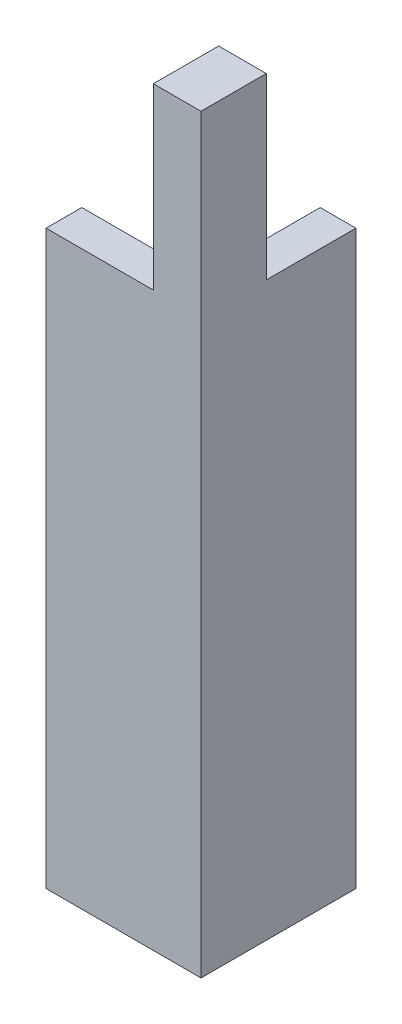
ISO-10303-21;
HEADER;
FILE_DESCRIPTION(('STEP AP214'),'2;1');
FILE_NAME('part.step','',(''),(''),'','','');
FILE_SCHEMA(('AUTOMOTIVE_DESIGN { 1 0 10303 214 1 1 1 1 }'));
ENDSEC;
DATA;
#1=APPLICATION_CONTEXT('core data for automotive mechanical design processes');
#2=APPLICATION_PROTOCOL_DEFINITION('international standard','automotive_design',2000,#1);
#3=PRODUCT_CONTEXT('',#1,'mechanical');
#4=PRODUCT('Part','Part','',(#3));
#5=PRODUCT_RELATED_PRODUCT_CATEGORY('part','',(#4));
#6=PRODUCT_DEFINITION_FORMATION('','',#4);
#7=PRODUCT_DEFINITION_CONTEXT('part definition',#1,'design');
#8=PRODUCT_DEFINITION('design','',#6,#7);
#9=PRODUCT_DEFINITION_SHAPE('','',#8);
#10=(LENGTH_UNIT() NAMED_UNIT(*) SI_UNIT(.MILLI.,.METRE.));
#11=(NAMED_UNIT(*) PLANE_ANGLE_UNIT() SI_UNIT($,.RADIAN.));
#12=(NAMED_UNIT(*) SI_UNIT($,.STERADIAN.) SOLID_ANGLE_UNIT());
#13=UNCERTAINTY_MEASURE_WITH_UNIT(LENGTH_MEASURE(1.E-05),#10,'distance_accuracy_value','');
#14=(GEOMETRIC_REPRESENTATION_CONTEXT(3) GLOBAL_UNCERTAINTY_ASSIGNED_CONTEXT((#13)) GLOBAL_UNIT_ASSIGNED_CONTEXT((#10,
#11,#12)) REPRESENTATION_CONTEXT('',''));
#15=CARTESIAN_POINT('',(0.,0.,0.));
#16=DIRECTION('',(0.,0.,1.));
#17=DIRECTION('',(1.,0.,0.));
#18=AXIS2_PLACEMENT_3D('',#15,#16,#17);
#19=CARTESIAN_POINT('',(0.,48.,0.));
#20=DIRECTION('',(0.,1.,0.));
#21=DIRECTION('',(0.,0.,1.));
#22=AXIS2_PLACEMENT_3D('',#19,#20,#21);
#23=PLANE('',#22);
#24=DIRECTION('',(0.,0.,1.));
#25=VECTOR('',#24,1.);
#26=CARTESIAN_POINT('',(9.00000000000001,48.,0.));
#27=LINE('',#26,#25);
#28=CARTESIAN_POINT('',(9.00000000000001,48.,-3.));
#29=VERTEX_POINT('',#28);
#30=CARTESIAN_POINT('',(9.,48.,0.));
#31=VERTEX_POINT('',#30);
#32=EDGE_CURVE('E149',#29,#31,#27,.T.);
#33=ORIENTED_EDGE('',*,*,#32,.F.);
#34=DIRECTION('',(-1.,0.,0.));
#35=VECTOR('',#34,1.);
#36=CARTESIAN_POINT('',(10.,48.,-3.));
#37=LINE('',#36,#35);
#38=CARTESIAN_POINT('',(0.,48.,-3.00000000000001));
#39=VERTEX_POINT('',#38);
#40=EDGE_CURVE('E174',#29,#39,#37,.T.);
#41=ORIENTED_EDGE('',*,*,#40,.T.);
#42=DIRECTION('',(0.,0.,1.));
#43=VECTOR('',#42,1.);
#44=CARTESIAN_POINT('',(0.,48.,-3.00000000000001));
#45=LINE('',#44,#43);
#46=CARTESIAN_POINT('',(0.,48.,0.));
#47=VERTEX_POINT('',#46);
#48=EDGE_CURVE('E161',#39,#47,#45,.T.);
#49=ORIENTED_EDGE('',*,*,#48,.T.);
#50=DIRECTION('',(1.,0.,0.));
#51=VECTOR('',#50,1.);
#52=CARTESIAN_POINT('',(0.,48.,0.));
#53=LINE('',#52,#51);
#54=EDGE_CURVE('E164',#47,#31,#53,.T.);
#55=ORIENTED_EDGE('',*,*,#54,.T.);
#56=EDGE_LOOP('',(#33,#41,#49,#55));
#57=FACE_BOUND('',#56,.T.);
#58=ADVANCED_FACE('F33',(#57),#23,.T.);
#59=CARTESIAN_POINT('',(0.,48.,-3.00000000000001));
#60=DIRECTION('',(1.,0.,0.));
#61=DIRECTION('',(0.,0.,-1.));
#62=AXIS2_PLACEMENT_3D('',#59,#60,#61);
#63=PLANE('',#62);
#64=DIRECTION('',(0.,0.,1.));
#65=VECTOR('',#64,1.);
#66=CARTESIAN_POINT('',(0.,0.,-3.00000000000001));
#67=LINE('',#66,#65);
#68=CARTESIAN_POINT('',(0.,0.,-3.00000000000001));
#69=VERTEX_POINT('',#68);
#70=CARTESIAN_POINT('',(0.,0.,0.));
#71=VERTEX_POINT('',#70);
#72=EDGE_CURVE('E150',#69,#71,#67,.T.);
#73=ORIENTED_EDGE('',*,*,#72,.T.);
#74=DIRECTION('',(0.,-1.,0.));
#75=VECTOR('',#74,1.);
#76=CARTESIAN_POINT('',(0.,48.,0.));
#77=LINE('',#76,#75);
#78=EDGE_CURVE('E197',#47,#71,#77,.T.);
#79=ORIENTED_EDGE('',*,*,#78,.F.);
#80=ORIENTED_EDGE('',*,*,#48,.F.);
#81=DIRECTION('',(0.,-1.,0.));
#82=VECTOR('',#81,1.);
#83=CARTESIAN_POINT('',(0.,48.,-3.00000000000001));
#84=LINE('',#83,#82);
#85=EDGE_CURVE('E175',#39,#69,#84,.T.);
#86=ORIENTED_EDGE('',*,*,#85,.T.);
#87=EDGE_LOOP('',(#73,#79,#80,#86));
#88=FACE_BOUND('',#87,.T.);
#89=ADVANCED_FACE('F252',(#88),#63,.F.);
#90=CARTESIAN_POINT('',(0.,48.,0.));
#91=DIRECTION('',(0.,0.,-1.));
#92=DIRECTION('',(-1.,0.,0.));
#93=AXIS2_PLACEMENT_3D('',#90,#91,#92);
#94=PLANE('',#93);
#95=DIRECTION('',(1.,0.,0.));
#96=VECTOR('',#95,1.);
#97=CARTESIAN_POINT('',(0.,0.,0.));
#98=LINE('',#97,#96);
#99=CARTESIAN_POINT('',(13.,0.,0.));
#100=VERTEX_POINT('',#99);
#101=EDGE_CURVE('E154',#71,#100,#98,.T.);
#102=ORIENTED_EDGE('',*,*,#101,.T.);
#103=DIRECTION('',(0.,-1.,0.));
#104=VECTOR('',#103,1.);
#105=CARTESIAN_POINT('',(13.,48.,0.));
#106=LINE('',#105,#104);
#107=CARTESIAN_POINT('',(13.,63.,0.));
#108=VERTEX_POINT('',#107);
#109=EDGE_CURVE('E134',#108,#100,#106,.T.);
#110=ORIENTED_EDGE('',*,*,#109,.F.);
#111=DIRECTION('',(1.,0.,0.));
#112=VECTOR('',#111,1.);
#113=CARTESIAN_POINT('',(9.00000000000001,63.,0.));
#114=LINE('',#113,#112);
#115=CARTESIAN_POINT('',(9.00000000000001,63.,0.));
#116=VERTEX_POINT('',#115);
#117=EDGE_CURVE('E128',#116,#108,#114,.T.);
#118=ORIENTED_EDGE('',*,*,#117,.F.);
#119=DIRECTION('',(0.,-1.,0.));
#120=VECTOR('',#119,1.);
#121=CARTESIAN_POINT('',(9.00000000000001,63.,0.));
#122=LINE('',#121,#120);
#123=EDGE_CURVE('E132',#116,#31,#122,.T.);
#124=ORIENTED_EDGE('',*,*,#123,.T.);
#125=ORIENTED_EDGE('',*,*,#54,.F.);
#126=ORIENTED_EDGE('',*,*,#78,.T.);
#127=EDGE_LOOP('',(#102,#110,#118,#124,#125,#126));
#128=FACE_BOUND('',#127,.T.);
#129=ADVANCED_FACE('F130',(#128),#94,.F.);
#130=CARTESIAN_POINT('',(13.,48.,0.));
#131=DIRECTION('',(-1.,0.,0.));
#132=DIRECTION('',(0.,0.,1.));
#133=AXIS2_PLACEMENT_3D('',#130,#131,#132);
#134=PLANE('',#133);
#135=DIRECTION('',(0.,0.,-1.));
#136=VECTOR('',#135,1.);
#137=CARTESIAN_POINT('',(13.,0.,0.));
#138=LINE('',#137,#136);
#139=CARTESIAN_POINT('',(13.,0.,-13.));
#140=VERTEX_POINT('',#139);
#141=EDGE_CURVE('E178',#100,#140,#138,.T.);
#142=ORIENTED_EDGE('',*,*,#141,.T.);
#143=DIRECTION('',(0.,-1.,0.));
#144=VECTOR('',#143,1.);
#145=CARTESIAN_POINT('',(13.,48.,-13.));
#146=LINE('',#145,#144);
#147=CARTESIAN_POINT('',(13.,48.,-13.));
#148=VERTEX_POINT('',#147);
#149=EDGE_CURVE('E193',#148,#140,#146,.T.);
#150=ORIENTED_EDGE('',*,*,#149,.F.);
#151=DIRECTION('',(0.,0.,-1.));
#152=VECTOR('',#151,1.);
#153=CARTESIAN_POINT('',(13.,48.,0.));
#154=LINE('',#153,#152);
#155=CARTESIAN_POINT('',(13.,48.,-5.48));
#156=VERTEX_POINT('',#155);
#157=EDGE_CURVE('E167',#156,#148,#154,.T.);
#158=ORIENTED_EDGE('',*,*,#157,.F.);
#159=DIRECTION('',(0.,-1.,0.));
#160=VECTOR('',#159,1.);
#161=CARTESIAN_POINT('',(13.,63.,-5.48));
#162=LINE('',#161,#160);
#163=CARTESIAN_POINT('',(13.,63.,-5.48));
#164=VERTEX_POINT('',#163);
#165=EDGE_CURVE('E151',#164,#156,#162,.T.);
#166=ORIENTED_EDGE('',*,*,#165,.F.);
#167=DIRECTION('',(0.,0.,-1.));
#168=VECTOR('',#167,1.);
#169=CARTESIAN_POINT('',(13.,63.,0.));
#170=LINE('',#169,#168);
#171=EDGE_CURVE('E137',#108,#164,#170,.T.);
#172=ORIENTED_EDGE('',*,*,#171,.F.);
#173=ORIENTED_EDGE('',*,*,#109,.T.);
#174=EDGE_LOOP('',(#142,#150,#158,#166,#172,#173));
#175=FACE_BOUND('',#174,.T.);
#176=ADVANCED_FACE('F235',(#175),#134,.F.);
#177=CARTESIAN_POINT('',(13.,48.,-13.));
#178=DIRECTION('',(0.,0.,1.));
#179=DIRECTION('',(1.,0.,0.));
#180=AXIS2_PLACEMENT_3D('',#177,#178,#179);
#181=PLANE('',#180);
#182=DIRECTION('',(-1.,0.,0.));
#183=VECTOR('',#182,1.);
#184=CARTESIAN_POINT('',(13.,0.,-13.));
#185=LINE('',#184,#183);
#186=CARTESIAN_POINT('',(10.,0.,-13.));
#187=VERTEX_POINT('',#186);
#188=EDGE_CURVE('E180',#140,#187,#185,.T.);
#189=ORIENTED_EDGE('',*,*,#188,.T.);
#190=DIRECTION('',(0.,-1.,0.));
#191=VECTOR('',#190,1.);
#192=CARTESIAN_POINT('',(10.,48.,-13.));
#193=LINE('',#192,#191);
#194=CARTESIAN_POINT('',(10.,48.,-13.));
#195=VERTEX_POINT('',#194);
#196=EDGE_CURVE('E190',#195,#187,#193,.T.);
#197=ORIENTED_EDGE('',*,*,#196,.F.);
#198=DIRECTION('',(-1.,0.,0.));
#199=VECTOR('',#198,1.);
#200=CARTESIAN_POINT('',(13.,48.,-13.));
#201=LINE('',#200,#199);
#202=EDGE_CURVE('E169',#148,#195,#201,.T.);
#203=ORIENTED_EDGE('',*,*,#202,.F.);
#204=ORIENTED_EDGE('',*,*,#149,.T.);
#205=EDGE_LOOP('',(#189,#197,#203,#204));
#206=FACE_BOUND('',#205,.T.);
#207=ADVANCED_FACE('F255',(#206),#181,.F.);
#208=CARTESIAN_POINT('',(10.,48.,-13.));
#209=DIRECTION('',(1.,0.,0.));
#210=DIRECTION('',(0.,0.,-1.));
#211=AXIS2_PLACEMENT_3D('',#208,#209,#210);
#212=PLANE('',#211);
#213=DIRECTION('',(0.,-1.,0.));
#214=VECTOR('',#213,1.);
#215=CARTESIAN_POINT('',(10.,48.,-3.));
#216=LINE('',#215,#214);
#217=CARTESIAN_POINT('',(10.,46.,-3.));
#218=VERTEX_POINT('',#217);
#219=CARTESIAN_POINT('',(10.,0.,-3.));
#220=VERTEX_POINT('',#219);
#221=EDGE_CURVE('E188',#218,#220,#216,.T.);
#222=ORIENTED_EDGE('',*,*,#221,.F.);
#223=CARTESIAN_POINT('',(10.,46.,-5.));
#224=DIRECTION('',(1.,0.,0.));
#225=DIRECTION('',(0.,0.,-1.));
#226=AXIS2_PLACEMENT_3D('',#223,#224,#225);
#227=CIRCLE('',#226,2.);
#228=CARTESIAN_POINT('',(10.,46.2679491924311,-3.01803046686496));
#229=VERTEX_POINT('',#228);
#230=EDGE_CURVE('E209',#218,#229,#227,.F.);
#231=ORIENTED_EDGE('',*,*,#230,.T.);
#232=DIRECTION('',(0.,0.,1.));
#233=VECTOR('',#232,1.);
#234=CARTESIAN_POINT('',(10.,46.2679491924311,-13.));
#235=LINE('',#234,#233);
#236=CARTESIAN_POINT('',(10.,46.2679491924311,-5.48));
#237=VERTEX_POINT('',#236);
#238=EDGE_CURVE('E206',#229,#237,#235,.F.);
#239=ORIENTED_EDGE('',*,*,#238,.T.);
#240=DIRECTION('',(0.,1.,0.));
#241=VECTOR('',#240,1.);
#242=CARTESIAN_POINT('',(10.,63.,-5.48));
#243=LINE('',#242,#241);
#244=CARTESIAN_POINT('',(10.,48.,-5.48));
#245=VERTEX_POINT('',#244);
#246=EDGE_CURVE('E204',#237,#245,#243,.T.);
#247=ORIENTED_EDGE('',*,*,#246,.T.);
#248=DIRECTION('',(0.,0.,1.));
#249=VECTOR('',#248,1.);
#250=CARTESIAN_POINT('',(10.,48.,-13.));
#251=LINE('',#250,#249);
#252=EDGE_CURVE('E171',#195,#245,#251,.T.);
#253=ORIENTED_EDGE('',*,*,#252,.F.);
#254=ORIENTED_EDGE('',*,*,#196,.T.);
#255=DIRECTION('',(0.,0.,1.));
#256=VECTOR('',#255,1.);
#257=CARTESIAN_POINT('',(10.,0.,-13.));
#258=LINE('',#257,#256);
#259=EDGE_CURVE('E182',#187,#220,#258,.T.);
#260=ORIENTED_EDGE('',*,*,#259,.T.);
#261=EDGE_LOOP('',(#222,#231,#239,#247,#253,#254,#260));
#262=FACE_BOUND('',#261,.T.);
#263=ADVANCED_FACE('F222',(#262),#212,.F.);
#264=CARTESIAN_POINT('',(10.,48.,-3.));
#265=DIRECTION('',(0.,0.,1.));
#266=DIRECTION('',(1.,0.,0.));
#267=AXIS2_PLACEMENT_3D('',#264,#265,#266);
#268=PLANE('',#267);
#269=ORIENTED_EDGE('',*,*,#40,.F.);
#270=DIRECTION('',(0.,-1.,0.));
#271=VECTOR('',#270,1.);
#272=CARTESIAN_POINT('',(9.00000000000001,63.,-3.));
#273=LINE('',#272,#271);
#274=CARTESIAN_POINT('',(9.00000000000001,46.,-3.));
#275=VERTEX_POINT('',#274);
#276=EDGE_CURVE('E54',#29,#275,#273,.T.);
#277=ORIENTED_EDGE('',*,*,#276,.T.);
#278=DIRECTION('',(-1.,0.,0.));
#279=VECTOR('',#278,1.);
#280=CARTESIAN_POINT('',(10.,46.,-3.));
#281=LINE('',#280,#279);
#282=EDGE_CURVE('E200',#275,#218,#281,.F.);
#283=ORIENTED_EDGE('',*,*,#282,.T.);
#284=ORIENTED_EDGE('',*,*,#221,.T.);
#285=DIRECTION('',(-1.,0.,0.));
#286=VECTOR('',#285,1.);
#287=CARTESIAN_POINT('',(10.,0.,-3.));
#288=LINE('',#287,#286);
#289=EDGE_CURVE('E165',#220,#69,#288,.T.);
#290=ORIENTED_EDGE('',*,*,#289,.T.);
#291=ORIENTED_EDGE('',*,*,#85,.F.);
#292=EDGE_LOOP('',(#269,#277,#283,#284,#290,#291));
#293=FACE_BOUND('',#292,.T.);
#294=ADVANCED_FACE('F216',(#293),#268,.F.);
#295=DIRECTION('',(-1.,0.,0.));
#296=VECTOR('',#295,1.);
#297=CARTESIAN_POINT('',(9.00000000000001,48.,-5.48));
#298=LINE('',#297,#296);
#299=EDGE_CURVE('E145',#156,#245,#298,.T.);
#300=ORIENTED_EDGE('',*,*,#299,.F.);
#301=ORIENTED_EDGE('',*,*,#157,.T.);
#302=ORIENTED_EDGE('',*,*,#202,.T.);
#303=ORIENTED_EDGE('',*,*,#252,.T.);
#304=EDGE_LOOP('',(#300,#301,#302,#303));
#305=FACE_BOUND('',#304,.T.);
#306=ADVANCED_FACE('F238',(#305),#23,.T.);
#307=CARTESIAN_POINT('',(0.,0.,0.));
#308=DIRECTION('',(0.,1.,0.));
#309=DIRECTION('',(0.,0.,1.));
#310=AXIS2_PLACEMENT_3D('',#307,#308,#309);
#311=PLANE('',#310);
#312=ORIENTED_EDGE('',*,*,#72,.F.);
#313=ORIENTED_EDGE('',*,*,#289,.F.);
#314=ORIENTED_EDGE('',*,*,#259,.F.);
#315=ORIENTED_EDGE('',*,*,#188,.F.);
#316=ORIENTED_EDGE('',*,*,#141,.F.);
#317=ORIENTED_EDGE('',*,*,#101,.F.);
#318=EDGE_LOOP('',(#312,#313,#314,#315,#316,#317));
#319=FACE_BOUND('',#318,.T.);
#320=ADVANCED_FACE('F248',(#319),#311,.F.);
#321=CARTESIAN_POINT('',(9.00000000000001,63.,0.));
#322=DIRECTION('',(1.,0.,0.));
#323=DIRECTION('',(0.,0.,-1.));
#324=AXIS2_PLACEMENT_3D('',#321,#322,#323);
#325=PLANE('',#324);
#326=CARTESIAN_POINT('',(9.00000000000001,48.,-5.48));
#327=VERTEX_POINT('',#326);
#328=CARTESIAN_POINT('',(9.00000000000001,48.,-5.));
#329=VERTEX_POINT('',#328);
#330=EDGE_CURVE('E60',#327,#329,#27,.T.);
#331=ORIENTED_EDGE('',*,*,#330,.T.);
#332=CARTESIAN_POINT('',(9.00000000000001,46.,-5.));
#333=DIRECTION('',(1.,0.,0.));
#334=DIRECTION('',(0.,0.,-1.));
#335=AXIS2_PLACEMENT_3D('',#332,#333,#334);
#336=CIRCLE('',#335,2.);
#337=EDGE_CURVE('E47',#329,#275,#336,.T.);
#338=ORIENTED_EDGE('',*,*,#337,.T.);
#339=ORIENTED_EDGE('',*,*,#276,.F.);
#340=ORIENTED_EDGE('',*,*,#32,.T.);
#341=ORIENTED_EDGE('',*,*,#123,.F.);
#342=DIRECTION('',(0.,0.,1.));
#343=VECTOR('',#342,1.);
#344=CARTESIAN_POINT('',(9.00000000000001,63.,0.));
#345=LINE('',#344,#343);
#346=CARTESIAN_POINT('',(9.00000000000001,63.,-5.48));
#347=VERTEX_POINT('',#346);
#348=EDGE_CURVE('E138',#347,#116,#345,.T.);
#349=ORIENTED_EDGE('',*,*,#348,.F.);
#350=DIRECTION('',(0.,-1.,0.));
#351=VECTOR('',#350,1.);
#352=CARTESIAN_POINT('',(9.00000000000001,63.,-5.48));
#353=LINE('',#352,#351);
#354=EDGE_CURVE('E157',#347,#327,#353,.T.);
#355=ORIENTED_EDGE('',*,*,#354,.T.);
#356=EDGE_LOOP('',(#331,#338,#339,#340,#341,#349,#355));
#357=FACE_BOUND('',#356,.T.);
#358=ADVANCED_FACE('F147',(#357),#325,.F.);
#359=CARTESIAN_POINT('',(9.00000000000001,63.,-5.48));
#360=DIRECTION('',(0.,0.,1.));
#361=DIRECTION('',(1.,0.,0.));
#362=AXIS2_PLACEMENT_3D('',#359,#360,#361);
#363=PLANE('',#362);
#364=ORIENTED_EDGE('',*,*,#299,.T.);
#365=ORIENTED_EDGE('',*,*,#246,.F.);
#366=CARTESIAN_POINT('',(8.,46.2679491924311,-5.48));
#367=DIRECTION('',(0.,0.,1.));
#368=DIRECTION('',(1.,0.,0.));
#369=AXIS2_PLACEMENT_3D('',#366,#367,#368);
#370=CIRCLE('',#369,2.);
#371=EDGE_CURVE('E11',#237,#327,#370,.T.);
#372=ORIENTED_EDGE('',*,*,#371,.T.);
#373=ORIENTED_EDGE('',*,*,#354,.F.);
#374=DIRECTION('',(-1.,0.,0.));
#375=VECTOR('',#374,1.);
#376=CARTESIAN_POINT('',(9.00000000000001,63.,-5.48));
#377=LINE('',#376,#375);
#378=EDGE_CURVE('E143',#164,#347,#377,.T.);
#379=ORIENTED_EDGE('',*,*,#378,.F.);
#380=ORIENTED_EDGE('',*,*,#165,.T.);
#381=EDGE_LOOP('',(#364,#365,#372,#373,#379,#380));
#382=FACE_BOUND('',#381,.T.);
#383=ADVANCED_FACE('F227',(#382),#363,.F.);
#384=CARTESIAN_POINT('',(0.,63.,0.));
#385=DIRECTION('',(0.,-1.,0.));
#386=DIRECTION('',(0.,0.,-1.));
#387=AXIS2_PLACEMENT_3D('',#384,#385,#386);
#388=PLANE('',#387);
#389=ORIENTED_EDGE('',*,*,#348,.T.);
#390=ORIENTED_EDGE('',*,*,#117,.T.);
#391=ORIENTED_EDGE('',*,*,#171,.T.);
#392=ORIENTED_EDGE('',*,*,#378,.T.);
#393=EDGE_LOOP('',(#389,#390,#391,#392));
#394=FACE_BOUND('',#393,.T.);
#395=ADVANCED_FACE('F141',(#394),#388,.F.);
#396=CARTESIAN_POINT('',(8.,46.2679491924311,0.));
#397=DIRECTION('',(0.,0.,1.));
#398=DIRECTION('',(1.,0.,0.));
#399=AXIS2_PLACEMENT_3D('',#396,#397,#398);
#400=CYLINDRICAL_SURFACE('',#399,2.);
#401=ORIENTED_EDGE('',*,*,#371,.F.);
#402=ORIENTED_EDGE('',*,*,#238,.F.);
#403=CARTESIAN_POINT('',(10.,46.2679491924311,-3.01803046686496));
#404=CARTESIAN_POINT('',(10.0000113929094,46.3143995278875,-3.02429822090386));
#405=CARTESIAN_POINT('',(9.99838229494038,46.3606100026442,-3.03221979814477));
#406=CARTESIAN_POINT('',(9.99202731608777,46.4521117304822,-3.05121494451758));
#407=CARTESIAN_POINT('',(9.9873048104661,46.4974039300404,-3.06228507078187));
#408=CARTESIAN_POINT('',(9.9750039458892,46.5863169040613,-3.08731893917282));
#409=CARTESIAN_POINT('',(9.967452569148,46.6299493094891,-3.10125479812959));
#410=CARTESIAN_POINT('',(9.94973114929899,46.7156846601533,-3.13188056122434));
#411=CARTESIAN_POINT('',(9.93956049688504,46.7577872469133,-3.14857110584318));
#412=CARTESIAN_POINT('',(9.90560014015441,46.8810699331737,-3.20230364167897));
#413=CARTESIAN_POINT('',(9.87829484918545,46.9596786947716,-3.24313707423642));
#414=CARTESIAN_POINT('',(9.81642311791428,47.108883813625,-3.33326111833371));
#415=CARTESIAN_POINT('',(9.78183781856471,47.1794586124207,-3.38257363317621));
#416=CARTESIAN_POINT('',(9.69128320544332,47.3410091468815,-3.51120604709685));
#417=CARTESIAN_POINT('',(9.63255933774619,47.4274902366408,-3.594243422263));
#418=CARTESIAN_POINT('',(9.51001610782499,47.5831242184823,-3.77208976076423));
#419=CARTESIAN_POINT('',(9.44618567833513,47.6522380520314,-3.86692455317347));
#420=CARTESIAN_POINT('',(9.33023156588481,47.7631976716105,-4.05096500524918));
#421=CARTESIAN_POINT('',(9.27793268787815,47.8076695598434,-4.13846679095274));
#422=CARTESIAN_POINT('',(9.20428899049117,47.8650300180262,-4.27604249584463));
#423=CARTESIAN_POINT('',(9.1805599292702,47.882581355938,-4.32291254038426));
#424=CARTESIAN_POINT('',(9.13575287417779,47.9144050387316,-4.41895617883709));
#425=CARTESIAN_POINT('',(9.11467279897733,47.9286799652972,-4.46812792206162));
#426=CARTESIAN_POINT('',(9.07281375041642,47.9560870882296,-4.57862210182249));
#427=CARTESIAN_POINT('',(9.05287292955264,47.9684710895209,-4.64046219784645));
#428=CARTESIAN_POINT('',(9.02167567353953,47.9874050632189,-4.76704793917942));
#429=CARTESIAN_POINT('',(9.01037996872852,47.9939814374768,-4.83177901522406));
#430=CARTESIAN_POINT('',(9.00305664098111,47.9982317864586,-4.91417104046996));
#431=CARTESIAN_POINT('',(9.00191379767442,47.9988936707823,-4.93129760830719));
#432=CARTESIAN_POINT('',(9.00038567537368,47.9997777100761,-4.96561415407127));
#433=CARTESIAN_POINT('',(9.0000012077092,47.9999993941106,-4.98280418021854));
#434=CARTESIAN_POINT('',(9.,48.,-5.));
#435=B_SPLINE_CURVE_WITH_KNOTS('',3,(#403,#404,#405,#406,#407,#408,#409,#410,#411,#412,#413,
#414,#415,#416,#417,#418,#419,#420,#421,#422,#423,#424,#425,#426,#427,#428,#429,#430,#431,#432,
#433,#434),.UNSPECIFIED.,.F.,.F.,(4,2,2,2,2,2,2,2,2,2,2,2,2,2,2,4),(0.,0.140531203033632,
0.280909325281518,0.419981247703383,0.559085550847398,0.835882160879312,1.11340484406295,
1.5117482361863,1.91097963252418,2.24355331142159,2.4095592152434,2.57543386038025,
2.77322048692251,2.97010326391765,3.02161857854599,3.07318897574283),.UNSPECIFIED.);
#436=EDGE_CURVE('E38',#329,#229,#435,.F.);
#437=ORIENTED_EDGE('',*,*,#436,.F.);
#438=ORIENTED_EDGE('',*,*,#330,.F.);
#439=EDGE_LOOP('',(#401,#402,#437,#438));
#440=FACE_BOUND('',#439,.T.);
#441=ADVANCED_FACE('F35',(#440),#400,.F.);
#442=CARTESIAN_POINT('',(0.,46.,-5.00000000000001));
#443=DIRECTION('',(-1.,0.,0.));
#444=DIRECTION('',(0.,0.,1.));
#445=AXIS2_PLACEMENT_3D('',#442,#443,#444);
#446=CYLINDRICAL_SURFACE('',#445,2.);
#447=ORIENTED_EDGE('',*,*,#230,.F.);
#448=ORIENTED_EDGE('',*,*,#282,.F.);
#449=ORIENTED_EDGE('',*,*,#337,.F.);
#450=ORIENTED_EDGE('',*,*,#436,.T.);
#451=EDGE_LOOP('',(#447,#448,#449,#450));
#452=FACE_BOUND('',#451,.T.);
#453=ADVANCED_FACE('F219',(#452),#446,.F.);
#454=CLOSED_SHELL('',(#58,#89,#129,#176,#207,#263,#294,#306,#320,#358,#383,#395,#441,#453));
#455=MANIFOLD_SOLID_BREP('B2',#454);
#456=ADVANCED_BREP_SHAPE_REPRESENTATION('',(#18,#455),#14);
#457=SHAPE_DEFINITION_REPRESENTATION(#9,#456);
ENDSEC;
END-ISO-10303-21;
